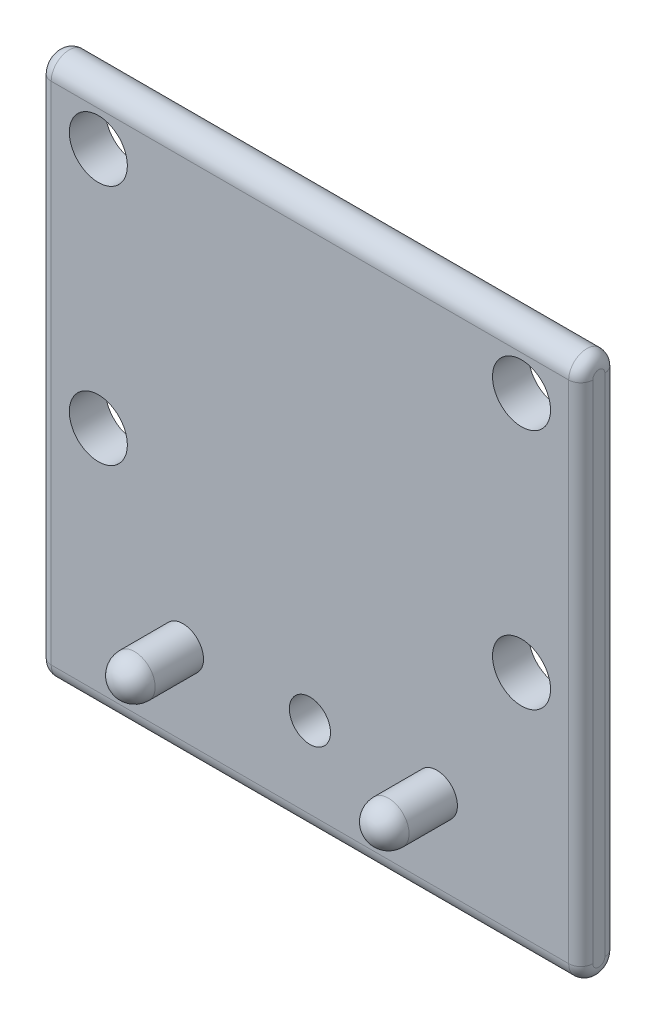
ISO-10303-21;
HEADER;
FILE_DESCRIPTION(('STEP AP214'),'2;1');
FILE_NAME('part.step','',(''),(''),'','','');
FILE_SCHEMA(('AUTOMOTIVE_DESIGN { 1 0 10303 214 1 1 1 1 }'));
ENDSEC;
DATA;
#1=APPLICATION_CONTEXT('core data for automotive mechanical design processes');
#2=APPLICATION_PROTOCOL_DEFINITION('international standard','automotive_design',2000,#1);
#3=PRODUCT_CONTEXT('',#1,'mechanical');
#4=PRODUCT('Part','Part','',(#3));
#5=PRODUCT_RELATED_PRODUCT_CATEGORY('part','',(#4));
#6=PRODUCT_DEFINITION_FORMATION('','',#4);
#7=PRODUCT_DEFINITION_CONTEXT('part definition',#1,'design');
#8=PRODUCT_DEFINITION('design','',#6,#7);
#9=PRODUCT_DEFINITION_SHAPE('','',#8);
#10=(LENGTH_UNIT() NAMED_UNIT(*) SI_UNIT(.MILLI.,.METRE.));
#11=(NAMED_UNIT(*) PLANE_ANGLE_UNIT() SI_UNIT($,.RADIAN.));
#12=(NAMED_UNIT(*) SI_UNIT($,.STERADIAN.) SOLID_ANGLE_UNIT());
#13=UNCERTAINTY_MEASURE_WITH_UNIT(LENGTH_MEASURE(1.E-05),#10,'distance_accuracy_value','');
#14=(GEOMETRIC_REPRESENTATION_CONTEXT(3) GLOBAL_UNCERTAINTY_ASSIGNED_CONTEXT((#13)) GLOBAL_UNIT_ASSIGNED_CONTEXT((#10,
#11,#12)) REPRESENTATION_CONTEXT('',''));
#15=CARTESIAN_POINT('',(0.,0.,0.));
#16=DIRECTION('',(0.,0.,1.));
#17=DIRECTION('',(1.,0.,0.));
#18=AXIS2_PLACEMENT_3D('',#15,#16,#17);
#19=CARTESIAN_POINT('',(22.4,43.305,0.));
#20=DIRECTION('',(1.,0.,0.));
#21=DIRECTION('',(0.,0.,-1.));
#22=AXIS2_PLACEMENT_3D('',#19,#20,#21);
#23=CYLINDRICAL_SURFACE('',#22,1.495);
#24=DIRECTION('',(1.,0.,0.));
#25=VECTOR('',#24,1.);
#26=CARTESIAN_POINT('',(-22.4,43.305,1.495));
#27=LINE('',#26,#25);
#28=CARTESIAN_POINT('',(21.4,43.305,1.495));
#29=VERTEX_POINT('',#28);
#30=CARTESIAN_POINT('',(-21.4,43.305,1.495));
#31=VERTEX_POINT('',#30);
#32=EDGE_CURVE('E473',#29,#31,#27,.F.);
#33=ORIENTED_EDGE('',*,*,#32,.F.);
#34=CARTESIAN_POINT('',(21.4,43.305,0.));
#35=DIRECTION('',(-1.,0.,0.));
#36=DIRECTION('',(0.,0.,1.));
#37=AXIS2_PLACEMENT_3D('',#34,#35,#36);
#38=CIRCLE('',#37,1.495);
#39=CARTESIAN_POINT('',(21.4,43.305,-1.495));
#40=VERTEX_POINT('',#39);
#41=EDGE_CURVE('E58',#29,#40,#38,.T.);
#42=ORIENTED_EDGE('',*,*,#41,.T.);
#43=DIRECTION('',(1.,0.,0.));
#44=VECTOR('',#43,1.);
#45=CARTESIAN_POINT('',(-22.4,43.305,-1.495));
#46=LINE('',#45,#44);
#47=CARTESIAN_POINT('',(-21.4,43.305,-1.495));
#48=VERTEX_POINT('',#47);
#49=EDGE_CURVE('E139',#48,#40,#46,.T.);
#50=ORIENTED_EDGE('',*,*,#49,.F.);
#51=CARTESIAN_POINT('',(-21.4,43.305,0.));
#52=DIRECTION('',(1.,0.,0.));
#53=DIRECTION('',(0.,0.,-1.));
#54=AXIS2_PLACEMENT_3D('',#51,#52,#53);
#55=CIRCLE('',#54,1.495);
#56=EDGE_CURVE('E156',#48,#31,#55,.T.);
#57=ORIENTED_EDGE('',*,*,#56,.T.);
#58=EDGE_LOOP('',(#33,#42,#50,#57));
#59=FACE_BOUND('',#58,.T.);
#60=ADVANCED_FACE('F48',(#59),#23,.T.);
#61=CARTESIAN_POINT('',(-22.4,1.495,0.));
#62=DIRECTION('',(1.,0.,0.));
#63=DIRECTION('',(0.,0.,-1.));
#64=AXIS2_PLACEMENT_3D('',#61,#62,#63);
#65=CYLINDRICAL_SURFACE('',#64,1.495);
#66=DIRECTION('',(-1.,0.,0.));
#67=VECTOR('',#66,1.);
#68=CARTESIAN_POINT('',(-22.4,1.495,-1.495));
#69=LINE('',#68,#67);
#70=CARTESIAN_POINT('',(21.4,1.495,-1.495));
#71=VERTEX_POINT('',#70);
#72=CARTESIAN_POINT('',(-21.4,1.495,-1.495));
#73=VERTEX_POINT('',#72);
#74=EDGE_CURVE('E219',#71,#73,#69,.T.);
#75=ORIENTED_EDGE('',*,*,#74,.F.);
#76=CARTESIAN_POINT('',(21.4,1.495,0.));
#77=DIRECTION('',(-1.,0.,0.));
#78=DIRECTION('',(0.,0.,1.));
#79=AXIS2_PLACEMENT_3D('',#76,#77,#78);
#80=CIRCLE('',#79,1.495);
#81=CARTESIAN_POINT('',(21.4,1.495,1.495));
#82=VERTEX_POINT('',#81);
#83=EDGE_CURVE('E185',#71,#82,#80,.T.);
#84=ORIENTED_EDGE('',*,*,#83,.T.);
#85=DIRECTION('',(-1.,0.,0.));
#86=VECTOR('',#85,1.);
#87=CARTESIAN_POINT('',(-22.4,1.495,1.495));
#88=LINE('',#87,#86);
#89=CARTESIAN_POINT('',(-21.4,1.495,1.495));
#90=VERTEX_POINT('',#89);
#91=EDGE_CURVE('E226',#90,#82,#88,.F.);
#92=ORIENTED_EDGE('',*,*,#91,.F.);
#93=CARTESIAN_POINT('',(-21.4,1.495,0.));
#94=DIRECTION('',(1.,0.,0.));
#95=DIRECTION('',(0.,0.,-1.));
#96=AXIS2_PLACEMENT_3D('',#93,#94,#95);
#97=CIRCLE('',#96,1.495);
#98=EDGE_CURVE('E124',#90,#73,#97,.T.);
#99=ORIENTED_EDGE('',*,*,#98,.T.);
#100=EDGE_LOOP('',(#75,#84,#92,#99));
#101=FACE_BOUND('',#100,.T.);
#102=ADVANCED_FACE('F222',(#101),#65,.T.);
#103=CARTESIAN_POINT('',(22.4,44.8,1.495));
#104=DIRECTION('',(-1.,0.,0.));
#105=DIRECTION('',(0.,0.,1.));
#106=AXIS2_PLACEMENT_3D('',#103,#104,#105);
#107=PLANE('',#106);
#108=DIRECTION('',(0.,-1.,0.));
#109=VECTOR('',#108,1.);
#110=CARTESIAN_POINT('',(22.4,44.8,0.495));
#111=LINE('',#110,#109);
#112=CARTESIAN_POINT('',(22.4,43.305,0.495000000000001));
#113=VERTEX_POINT('',#112);
#114=CARTESIAN_POINT('',(22.4,1.495,0.495));
#115=VERTEX_POINT('',#114);
#116=EDGE_CURVE('E178',#113,#115,#111,.T.);
#117=ORIENTED_EDGE('',*,*,#116,.T.);
#118=CARTESIAN_POINT('',(22.4,1.495,0.));
#119=DIRECTION('',(-1.,0.,0.));
#120=DIRECTION('',(0.,0.,1.));
#121=AXIS2_PLACEMENT_3D('',#118,#119,#120);
#122=CIRCLE('',#121,0.495000000000001);
#123=CARTESIAN_POINT('',(22.4,1.495,-0.495));
#124=VERTEX_POINT('',#123);
#125=EDGE_CURVE('E181',#115,#124,#122,.F.);
#126=ORIENTED_EDGE('',*,*,#125,.T.);
#127=DIRECTION('',(0.,-1.,0.));
#128=VECTOR('',#127,1.);
#129=CARTESIAN_POINT('',(22.4,44.8,-0.495));
#130=LINE('',#129,#128);
#131=CARTESIAN_POINT('',(22.4,43.305,-0.495));
#132=VERTEX_POINT('',#131);
#133=EDGE_CURVE('E162',#124,#132,#130,.F.);
#134=ORIENTED_EDGE('',*,*,#133,.T.);
#135=CARTESIAN_POINT('',(22.4,43.305,0.));
#136=DIRECTION('',(-1.,0.,0.));
#137=DIRECTION('',(0.,0.,1.));
#138=AXIS2_PLACEMENT_3D('',#135,#136,#137);
#139=CIRCLE('',#138,0.495000000000001);
#140=EDGE_CURVE('E175',#132,#113,#139,.F.);
#141=ORIENTED_EDGE('',*,*,#140,.T.);
#142=EDGE_LOOP('',(#117,#126,#134,#141));
#143=FACE_BOUND('',#142,.T.);
#144=ADVANCED_FACE('F232',(#143),#107,.F.);
#145=CARTESIAN_POINT('',(-22.4,44.8,-1.495));
#146=DIRECTION('',(0.,0.,1.));
#147=DIRECTION('',(1.,0.,0.));
#148=AXIS2_PLACEMENT_3D('',#145,#146,#147);
#149=PLANE('',#148);
#150=CARTESIAN_POINT('',(0.,8.2,-1.495));
#151=DIRECTION('',(0.,0.,1.));
#152=DIRECTION('',(1.,0.,0.));
#153=AXIS2_PLACEMENT_3D('',#150,#151,#152);
#154=CIRCLE('',#153,1.7);
#155=CARTESIAN_POINT('',(1.7,8.2,-1.495));
#156=VERTEX_POINT('',#155);
#157=EDGE_CURVE('E515',#156,#156,#154,.T.);
#158=ORIENTED_EDGE('',*,*,#157,.T.);
#159=EDGE_LOOP('',(#158));
#160=FACE_BOUND('',#159,.T.);
#161=CARTESIAN_POINT('',(-17.5,40.4,-1.495));
#162=DIRECTION('',(0.,0.,1.));
#163=DIRECTION('',(1.,0.,0.));
#164=AXIS2_PLACEMENT_3D('',#161,#162,#163);
#165=CIRCLE('',#164,2.39999999999999);
#166=CARTESIAN_POINT('',(-15.1,40.4,-1.495));
#167=VERTEX_POINT('',#166);
#168=EDGE_CURVE('E509',#167,#167,#165,.T.);
#169=ORIENTED_EDGE('',*,*,#168,.T.);
#170=EDGE_LOOP('',(#169));
#171=FACE_BOUND('',#170,.T.);
#172=CARTESIAN_POINT('',(-17.5,20.4,-1.495));
#173=DIRECTION('',(0.,0.,1.));
#174=DIRECTION('',(1.,0.,0.));
#175=AXIS2_PLACEMENT_3D('',#172,#173,#174);
#176=CIRCLE('',#175,2.39999999999999);
#177=CARTESIAN_POINT('',(-15.1,20.4,-1.495));
#178=VERTEX_POINT('',#177);
#179=EDGE_CURVE('E502',#178,#178,#176,.T.);
#180=ORIENTED_EDGE('',*,*,#179,.T.);
#181=EDGE_LOOP('',(#180));
#182=FACE_BOUND('',#181,.T.);
#183=CARTESIAN_POINT('',(17.5,20.4,-1.495));
#184=DIRECTION('',(0.,0.,1.));
#185=DIRECTION('',(1.,0.,0.));
#186=AXIS2_PLACEMENT_3D('',#183,#184,#185);
#187=CIRCLE('',#186,2.39999999999999);
#188=CARTESIAN_POINT('',(19.9,20.4,-1.495));
#189=VERTEX_POINT('',#188);
#190=EDGE_CURVE('E454',#189,#189,#187,.T.);
#191=ORIENTED_EDGE('',*,*,#190,.T.);
#192=EDGE_LOOP('',(#191));
#193=FACE_BOUND('',#192,.T.);
#194=CARTESIAN_POINT('',(17.5,40.4,-1.495));
#195=DIRECTION('',(0.,0.,1.));
#196=DIRECTION('',(1.,0.,0.));
#197=AXIS2_PLACEMENT_3D('',#194,#195,#196);
#198=CIRCLE('',#197,2.39999999999999);
#199=CARTESIAN_POINT('',(19.9,40.4,-1.495));
#200=VERTEX_POINT('',#199);
#201=EDGE_CURVE('E448',#200,#200,#198,.T.);
#202=ORIENTED_EDGE('',*,*,#201,.T.);
#203=EDGE_LOOP('',(#202));
#204=FACE_BOUND('',#203,.T.);
#205=ORIENTED_EDGE('',*,*,#49,.T.);
#206=DIRECTION('',(0.,-1.,0.));
#207=VECTOR('',#206,1.);
#208=CARTESIAN_POINT('',(21.4,44.8,-1.495));
#209=LINE('',#208,#207);
#210=EDGE_CURVE('E11',#40,#71,#209,.T.);
#211=ORIENTED_EDGE('',*,*,#210,.T.);
#212=ORIENTED_EDGE('',*,*,#74,.T.);
#213=DIRECTION('',(0.,-1.,0.));
#214=VECTOR('',#213,1.);
#215=CARTESIAN_POINT('',(-21.4,44.8,-1.495));
#216=LINE('',#215,#214);
#217=EDGE_CURVE('E149',#73,#48,#216,.F.);
#218=ORIENTED_EDGE('',*,*,#217,.T.);
#219=EDGE_LOOP('',(#205,#211,#212,#218));
#220=FACE_BOUND('',#219,.T.);
#221=ADVANCED_FACE('F218',(#160,#171,#182,#193,#204,#220),#149,.F.);
#222=CARTESIAN_POINT('',(-22.4,44.8,1.495));
#223=DIRECTION('',(1.,0.,0.));
#224=DIRECTION('',(0.,0.,-1.));
#225=AXIS2_PLACEMENT_3D('',#222,#223,#224);
#226=PLANE('',#225);
#227=DIRECTION('',(0.,-1.,0.));
#228=VECTOR('',#227,1.);
#229=CARTESIAN_POINT('',(-22.4,44.8,-0.495));
#230=LINE('',#229,#228);
#231=CARTESIAN_POINT('',(-22.4,43.305,-0.495000000000001));
#232=VERTEX_POINT('',#231);
#233=CARTESIAN_POINT('',(-22.4,1.495,-0.495));
#234=VERTEX_POINT('',#233);
#235=EDGE_CURVE('E143',#232,#234,#230,.T.);
#236=ORIENTED_EDGE('',*,*,#235,.T.);
#237=CARTESIAN_POINT('',(-22.4,1.495,0.));
#238=DIRECTION('',(1.,0.,0.));
#239=DIRECTION('',(0.,0.,-1.));
#240=AXIS2_PLACEMENT_3D('',#237,#238,#239);
#241=CIRCLE('',#240,0.495000000000001);
#242=CARTESIAN_POINT('',(-22.4,1.495,0.495));
#243=VERTEX_POINT('',#242);
#244=EDGE_CURVE('E122',#234,#243,#241,.F.);
#245=ORIENTED_EDGE('',*,*,#244,.T.);
#246=DIRECTION('',(0.,-1.,0.));
#247=VECTOR('',#246,1.);
#248=CARTESIAN_POINT('',(-22.4,44.8,0.495));
#249=LINE('',#248,#247);
#250=CARTESIAN_POINT('',(-22.4,43.305,0.495));
#251=VERTEX_POINT('',#250);
#252=EDGE_CURVE('E131',#243,#251,#249,.F.);
#253=ORIENTED_EDGE('',*,*,#252,.T.);
#254=CARTESIAN_POINT('',(-22.4,43.305,0.));
#255=DIRECTION('',(1.,0.,0.));
#256=DIRECTION('',(0.,0.,-1.));
#257=AXIS2_PLACEMENT_3D('',#254,#255,#256);
#258=CIRCLE('',#257,0.495000000000001);
#259=EDGE_CURVE('E138',#251,#232,#258,.F.);
#260=ORIENTED_EDGE('',*,*,#259,.T.);
#261=EDGE_LOOP('',(#236,#245,#253,#260));
#262=FACE_BOUND('',#261,.T.);
#263=ADVANCED_FACE('F141',(#262),#226,.F.);
#264=CARTESIAN_POINT('',(-22.4,44.8,1.495));
#265=DIRECTION('',(0.,0.,-1.));
#266=DIRECTION('',(-1.,0.,0.));
#267=AXIS2_PLACEMENT_3D('',#264,#265,#266);
#268=PLANE('',#267);
#269=CARTESIAN_POINT('',(-10.5,8.2,1.495));
#270=DIRECTION('',(0.,0.,-1.));
#271=DIRECTION('',(-1.,0.,0.));
#272=AXIS2_PLACEMENT_3D('',#269,#270,#271);
#273=CIRCLE('',#272,1.7);
#274=CARTESIAN_POINT('',(-12.2,8.2,1.495));
#275=VERTEX_POINT('',#274);
#276=EDGE_CURVE('E469',#275,#275,#273,.F.);
#277=ORIENTED_EDGE('',*,*,#276,.F.);
#278=EDGE_LOOP('',(#277));
#279=FACE_BOUND('',#278,.T.);
#280=CARTESIAN_POINT('',(10.5,8.2,1.495));
#281=DIRECTION('',(0.,0.,-1.));
#282=DIRECTION('',(-1.,0.,0.));
#283=AXIS2_PLACEMENT_3D('',#280,#281,#282);
#284=CIRCLE('',#283,1.7);
#285=CARTESIAN_POINT('',(8.8,8.2,1.495));
#286=VERTEX_POINT('',#285);
#287=EDGE_CURVE('E225',#286,#286,#284,.F.);
#288=ORIENTED_EDGE('',*,*,#287,.F.);
#289=EDGE_LOOP('',(#288));
#290=FACE_BOUND('',#289,.T.);
#291=CARTESIAN_POINT('',(0.,8.2,1.495));
#292=DIRECTION('',(0.,0.,1.));
#293=DIRECTION('',(1.,0.,0.));
#294=AXIS2_PLACEMENT_3D('',#291,#292,#293);
#295=CIRCLE('',#294,1.7);
#296=CARTESIAN_POINT('',(1.7,8.2,1.495));
#297=VERTEX_POINT('',#296);
#298=EDGE_CURVE('E489',#297,#297,#295,.T.);
#299=ORIENTED_EDGE('',*,*,#298,.F.);
#300=EDGE_LOOP('',(#299));
#301=FACE_BOUND('',#300,.T.);
#302=CARTESIAN_POINT('',(-17.5,40.4,1.495));
#303=DIRECTION('',(0.,0.,1.));
#304=DIRECTION('',(1.,0.,0.));
#305=AXIS2_PLACEMENT_3D('',#302,#303,#304);
#306=CIRCLE('',#305,2.39999999999999);
#307=CARTESIAN_POINT('',(-15.1,40.4,1.495));
#308=VERTEX_POINT('',#307);
#309=EDGE_CURVE('E493',#308,#308,#306,.T.);
#310=ORIENTED_EDGE('',*,*,#309,.F.);
#311=EDGE_LOOP('',(#310));
#312=FACE_BOUND('',#311,.T.);
#313=CARTESIAN_POINT('',(-17.5,20.4,1.495));
#314=DIRECTION('',(0.,0.,1.));
#315=DIRECTION('',(1.,0.,0.));
#316=AXIS2_PLACEMENT_3D('',#313,#314,#315);
#317=CIRCLE('',#316,2.39999999999999);
#318=CARTESIAN_POINT('',(-15.1,20.4,1.495));
#319=VERTEX_POINT('',#318);
#320=EDGE_CURVE('E497',#319,#319,#317,.T.);
#321=ORIENTED_EDGE('',*,*,#320,.F.);
#322=EDGE_LOOP('',(#321));
#323=FACE_BOUND('',#322,.T.);
#324=CARTESIAN_POINT('',(17.5,20.4,1.495));
#325=DIRECTION('',(0.,0.,1.));
#326=DIRECTION('',(1.,0.,0.));
#327=AXIS2_PLACEMENT_3D('',#324,#325,#326);
#328=CIRCLE('',#327,2.39999999999999);
#329=CARTESIAN_POINT('',(19.9,20.4,1.495));
#330=VERTEX_POINT('',#329);
#331=EDGE_CURVE('E460',#330,#330,#328,.T.);
#332=ORIENTED_EDGE('',*,*,#331,.F.);
#333=EDGE_LOOP('',(#332));
#334=FACE_BOUND('',#333,.T.);
#335=CARTESIAN_POINT('',(17.5,40.4,1.495));
#336=DIRECTION('',(0.,0.,1.));
#337=DIRECTION('',(1.,0.,0.));
#338=AXIS2_PLACEMENT_3D('',#335,#336,#337);
#339=CIRCLE('',#338,2.39999999999999);
#340=CARTESIAN_POINT('',(19.9,40.4,1.495));
#341=VERTEX_POINT('',#340);
#342=EDGE_CURVE('E451',#341,#341,#339,.T.);
#343=ORIENTED_EDGE('',*,*,#342,.F.);
#344=EDGE_LOOP('',(#343));
#345=FACE_BOUND('',#344,.T.);
#346=ORIENTED_EDGE('',*,*,#91,.T.);
#347=DIRECTION('',(0.,-1.,0.));
#348=VECTOR('',#347,1.);
#349=CARTESIAN_POINT('',(21.4,44.8,1.495));
#350=LINE('',#349,#348);
#351=EDGE_CURVE('E73',#82,#29,#350,.F.);
#352=ORIENTED_EDGE('',*,*,#351,.T.);
#353=ORIENTED_EDGE('',*,*,#32,.T.);
#354=DIRECTION('',(0.,-1.,0.));
#355=VECTOR('',#354,1.);
#356=CARTESIAN_POINT('',(-21.4,44.8,1.495));
#357=LINE('',#356,#355);
#358=EDGE_CURVE('E160',#31,#90,#357,.T.);
#359=ORIENTED_EDGE('',*,*,#358,.T.);
#360=EDGE_LOOP('',(#346,#352,#353,#359));
#361=FACE_BOUND('',#360,.T.);
#362=ADVANCED_FACE('F278',(#279,#290,#301,#312,#323,#334,#345,#361),#268,.F.);
#363=CARTESIAN_POINT('',(17.5,40.4,1.495));
#364=DIRECTION('',(0.,0.,1.));
#365=DIRECTION('',(1.,0.,0.));
#366=AXIS2_PLACEMENT_3D('',#363,#364,#365);
#367=CYLINDRICAL_SURFACE('',#366,2.39999999999999);
#368=ORIENTED_EDGE('',*,*,#201,.F.);
#369=EDGE_LOOP('',(#368));
#370=FACE_BOUND('',#369,.T.);
#371=ORIENTED_EDGE('',*,*,#342,.T.);
#372=EDGE_LOOP('',(#371));
#373=FACE_BOUND('',#372,.T.);
#374=ADVANCED_FACE('F281',(#370,#373),#367,.F.);
#375=CARTESIAN_POINT('',(17.5,20.4,1.495));
#376=DIRECTION('',(0.,0.,1.));
#377=DIRECTION('',(1.,0.,0.));
#378=AXIS2_PLACEMENT_3D('',#375,#376,#377);
#379=CYLINDRICAL_SURFACE('',#378,2.39999999999999);
#380=ORIENTED_EDGE('',*,*,#190,.F.);
#381=EDGE_LOOP('',(#380));
#382=FACE_BOUND('',#381,.T.);
#383=ORIENTED_EDGE('',*,*,#331,.T.);
#384=EDGE_LOOP('',(#383));
#385=FACE_BOUND('',#384,.T.);
#386=ADVANCED_FACE('F413',(#382,#385),#379,.F.);
#387=CARTESIAN_POINT('',(-17.5,20.4,1.495));
#388=DIRECTION('',(0.,0.,1.));
#389=DIRECTION('',(1.,0.,0.));
#390=AXIS2_PLACEMENT_3D('',#387,#388,#389);
#391=CYLINDRICAL_SURFACE('',#390,2.39999999999999);
#392=ORIENTED_EDGE('',*,*,#179,.F.);
#393=EDGE_LOOP('',(#392));
#394=FACE_BOUND('',#393,.T.);
#395=ORIENTED_EDGE('',*,*,#320,.T.);
#396=EDGE_LOOP('',(#395));
#397=FACE_BOUND('',#396,.T.);
#398=ADVANCED_FACE('F404',(#394,#397),#391,.F.);
#399=CARTESIAN_POINT('',(-17.5,40.4,1.495));
#400=DIRECTION('',(0.,0.,1.));
#401=DIRECTION('',(1.,0.,0.));
#402=AXIS2_PLACEMENT_3D('',#399,#400,#401);
#403=CYLINDRICAL_SURFACE('',#402,2.39999999999999);
#404=ORIENTED_EDGE('',*,*,#168,.F.);
#405=EDGE_LOOP('',(#404));
#406=FACE_BOUND('',#405,.T.);
#407=ORIENTED_EDGE('',*,*,#309,.T.);
#408=EDGE_LOOP('',(#407));
#409=FACE_BOUND('',#408,.T.);
#410=ADVANCED_FACE('F395',(#406,#409),#403,.F.);
#411=CARTESIAN_POINT('',(0.,8.2,1.495));
#412=DIRECTION('',(0.,0.,1.));
#413=DIRECTION('',(1.,0.,0.));
#414=AXIS2_PLACEMENT_3D('',#411,#412,#413);
#415=CYLINDRICAL_SURFACE('',#414,1.7);
#416=ORIENTED_EDGE('',*,*,#157,.F.);
#417=EDGE_LOOP('',(#416));
#418=FACE_BOUND('',#417,.T.);
#419=ORIENTED_EDGE('',*,*,#298,.T.);
#420=EDGE_LOOP('',(#419));
#421=FACE_BOUND('',#420,.T.);
#422=ADVANCED_FACE('F386',(#418,#421),#415,.F.);
#423=CARTESIAN_POINT('',(10.5,8.2,5.495));
#424=DIRECTION('',(0.,0.,-1.));
#425=DIRECTION('',(-1.,0.,0.));
#426=AXIS2_PLACEMENT_3D('',#423,#424,#425);
#427=CYLINDRICAL_SURFACE('',#426,1.7);
#428=CARTESIAN_POINT('',(10.5,8.2,5.495));
#429=DIRECTION('',(0.,0.,1.));
#430=DIRECTION('',(1.,0.,0.));
#431=AXIS2_PLACEMENT_3D('',#428,#429,#430);
#432=CIRCLE('',#431,1.7);
#433=CARTESIAN_POINT('',(12.2,8.2,5.495));
#434=VERTEX_POINT('',#433);
#435=EDGE_CURVE('E172',#434,#434,#432,.T.);
#436=ORIENTED_EDGE('',*,*,#435,.F.);
#437=EDGE_LOOP('',(#436));
#438=FACE_BOUND('',#437,.T.);
#439=ORIENTED_EDGE('',*,*,#287,.T.);
#440=EDGE_LOOP('',(#439));
#441=FACE_BOUND('',#440,.T.);
#442=ADVANCED_FACE('F377',(#438,#441),#427,.T.);
#443=CARTESIAN_POINT('',(-10.5,8.2,5.495));
#444=DIRECTION('',(0.,0.,-1.));
#445=DIRECTION('',(-1.,0.,0.));
#446=AXIS2_PLACEMENT_3D('',#443,#444,#445);
#447=CYLINDRICAL_SURFACE('',#446,1.7);
#448=CARTESIAN_POINT('',(-10.5,8.2,5.495));
#449=DIRECTION('',(0.,0.,1.));
#450=DIRECTION('',(1.,0.,0.));
#451=AXIS2_PLACEMENT_3D('',#448,#449,#450);
#452=CIRCLE('',#451,1.7);
#453=CARTESIAN_POINT('',(-8.8,8.2,5.495));
#454=VERTEX_POINT('',#453);
#455=EDGE_CURVE('E521',#454,#454,#452,.T.);
#456=ORIENTED_EDGE('',*,*,#455,.F.);
#457=EDGE_LOOP('',(#456));
#458=FACE_BOUND('',#457,.T.);
#459=ORIENTED_EDGE('',*,*,#276,.T.);
#460=EDGE_LOOP('',(#459));
#461=FACE_BOUND('',#460,.T.);
#462=ADVANCED_FACE('F368',(#458,#461),#447,.T.);
#463=CARTESIAN_POINT('',(-10.5,8.2,5.495));
#464=DIRECTION('',(0.,1.,0.));
#465=DIRECTION('',(-1.,0.,0.));
#466=AXIS2_PLACEMENT_3D('',#463,#464,#465);
#467=SPHERICAL_SURFACE('',#466,1.7);
#468=CARTESIAN_POINT('',(-10.5,8.2,5.495));
#469=DIRECTION('',(0.,0.,1.));
#470=DIRECTION('',(1.,0.,0.));
#471=AXIS2_PLACEMENT_3D('',#468,#469,#470);
#472=SPHERICAL_SURFACE('',#471,1.7);
#473=ORIENTED_EDGE('',*,*,#455,.T.);
#474=EDGE_LOOP('',(#473));
#475=FACE_BOUND('',#474,.T.);
#476=ADVANCED_FACE('F360',(#475),#472,.T.);
#477=CARTESIAN_POINT('',(10.5,8.2,5.495));
#478=DIRECTION('',(0.,1.,0.));
#479=DIRECTION('',(-1.,0.,0.));
#480=AXIS2_PLACEMENT_3D('',#477,#478,#479);
#481=SPHERICAL_SURFACE('',#480,1.7);
#482=CARTESIAN_POINT('',(10.5,8.2,5.495));
#483=DIRECTION('',(0.,0.,1.));
#484=DIRECTION('',(1.,0.,0.));
#485=AXIS2_PLACEMENT_3D('',#482,#483,#484);
#486=SPHERICAL_SURFACE('',#485,1.7);
#487=ORIENTED_EDGE('',*,*,#435,.T.);
#488=EDGE_LOOP('',(#487));
#489=FACE_BOUND('',#488,.T.);
#490=ADVANCED_FACE('F262',(#489),#486,.T.);
#491=CARTESIAN_POINT('',(-21.4,43.305,0.));
#492=DIRECTION('',(1.,0.,0.));
#493=DIRECTION('',(0.,0.,-1.));
#494=AXIS2_PLACEMENT_3D('',#491,#492,#493);
#495=DEGENERATE_TOROIDAL_SURFACE('',#494,0.495000000000001,1.,.T.);
#496=CARTESIAN_POINT('',(-21.4,43.305,0.495000000000001));
#497=DIRECTION('',(0.,-1.,0.));
#498=DIRECTION('',(0.,0.,-1.));
#499=AXIS2_PLACEMENT_3D('',#496,#497,#498);
#500=CIRCLE('',#499,1.);
#501=EDGE_CURVE('E134',#31,#251,#500,.T.);
#502=ORIENTED_EDGE('',*,*,#501,.F.);
#503=ORIENTED_EDGE('',*,*,#56,.F.);
#504=CARTESIAN_POINT('',(-21.4,43.305,-0.495000000000001));
#505=DIRECTION('',(0.,-1.,0.));
#506=DIRECTION('',(0.,0.,-1.));
#507=AXIS2_PLACEMENT_3D('',#504,#505,#506);
#508=CIRCLE('',#507,1.);
#509=EDGE_CURVE('E168',#232,#48,#508,.T.);
#510=ORIENTED_EDGE('',*,*,#509,.F.);
#511=ORIENTED_EDGE('',*,*,#259,.F.);
#512=EDGE_LOOP('',(#502,#503,#510,#511));
#513=FACE_BOUND('',#512,.T.);
#514=ADVANCED_FACE('F258',(#513),#495,.T.);
#515=CARTESIAN_POINT('',(-21.4,44.8,-0.495));
#516=DIRECTION('',(0.,-1.,0.));
#517=DIRECTION('',(0.,0.,-1.));
#518=AXIS2_PLACEMENT_3D('',#515,#516,#517);
#519=CYLINDRICAL_SURFACE('',#518,1.);
#520=ORIENTED_EDGE('',*,*,#509,.T.);
#521=ORIENTED_EDGE('',*,*,#217,.F.);
#522=CARTESIAN_POINT('',(-21.4,1.495,-0.495));
#523=DIRECTION('',(0.,-1.,0.));
#524=DIRECTION('',(0.,0.,-1.));
#525=AXIS2_PLACEMENT_3D('',#522,#523,#524);
#526=CIRCLE('',#525,1.);
#527=EDGE_CURVE('E128',#234,#73,#526,.T.);
#528=ORIENTED_EDGE('',*,*,#527,.F.);
#529=ORIENTED_EDGE('',*,*,#235,.F.);
#530=EDGE_LOOP('',(#520,#521,#528,#529));
#531=FACE_BOUND('',#530,.T.);
#532=ADVANCED_FACE('F255',(#531),#519,.T.);
#533=CARTESIAN_POINT('',(-21.4,44.8,0.495));
#534=DIRECTION('',(0.,-1.,0.));
#535=DIRECTION('',(0.,0.,-1.));
#536=AXIS2_PLACEMENT_3D('',#533,#534,#535);
#537=CYLINDRICAL_SURFACE('',#536,1.);
#538=ORIENTED_EDGE('',*,*,#501,.T.);
#539=ORIENTED_EDGE('',*,*,#252,.F.);
#540=CARTESIAN_POINT('',(-21.4,1.495,0.495));
#541=DIRECTION('',(0.,-1.,0.));
#542=DIRECTION('',(0.,0.,-1.));
#543=AXIS2_PLACEMENT_3D('',#540,#541,#542);
#544=CIRCLE('',#543,1.);
#545=EDGE_CURVE('E117',#90,#243,#544,.T.);
#546=ORIENTED_EDGE('',*,*,#545,.F.);
#547=ORIENTED_EDGE('',*,*,#358,.F.);
#548=EDGE_LOOP('',(#538,#539,#546,#547));
#549=FACE_BOUND('',#548,.T.);
#550=ADVANCED_FACE('F132',(#549),#537,.T.);
#551=CARTESIAN_POINT('',(-21.4,1.495,0.));
#552=DIRECTION('',(1.,0.,0.));
#553=DIRECTION('',(0.,0.,-1.));
#554=AXIS2_PLACEMENT_3D('',#551,#552,#553);
#555=DEGENERATE_TOROIDAL_SURFACE('',#554,0.495000000000001,1.,.T.);
#556=ORIENTED_EDGE('',*,*,#527,.T.);
#557=ORIENTED_EDGE('',*,*,#98,.F.);
#558=ORIENTED_EDGE('',*,*,#545,.T.);
#559=ORIENTED_EDGE('',*,*,#244,.F.);
#560=EDGE_LOOP('',(#556,#557,#558,#559));
#561=FACE_BOUND('',#560,.T.);
#562=ADVANCED_FACE('F120',(#561),#555,.T.);
#563=CARTESIAN_POINT('',(21.4,43.305,0.));
#564=DIRECTION('',(-1.,0.,0.));
#565=DIRECTION('',(0.,0.,1.));
#566=AXIS2_PLACEMENT_3D('',#563,#564,#565);
#567=DEGENERATE_TOROIDAL_SURFACE('',#566,0.495000000000001,1.,.T.);
#568=CARTESIAN_POINT('',(21.4,43.305,-0.495000000000001));
#569=DIRECTION('',(0.,-1.,0.));
#570=DIRECTION('',(0.,0.,-1.));
#571=AXIS2_PLACEMENT_3D('',#568,#569,#570);
#572=CIRCLE('',#571,1.);
#573=EDGE_CURVE('E198',#40,#132,#572,.T.);
#574=ORIENTED_EDGE('',*,*,#573,.F.);
#575=ORIENTED_EDGE('',*,*,#41,.F.);
#576=CARTESIAN_POINT('',(21.4,43.305,0.495000000000001));
#577=DIRECTION('',(0.,-1.,0.));
#578=DIRECTION('',(0.,0.,-1.));
#579=AXIS2_PLACEMENT_3D('',#576,#577,#578);
#580=CIRCLE('',#579,1.);
#581=EDGE_CURVE('E52',#113,#29,#580,.T.);
#582=ORIENTED_EDGE('',*,*,#581,.F.);
#583=ORIENTED_EDGE('',*,*,#140,.F.);
#584=EDGE_LOOP('',(#574,#575,#582,#583));
#585=FACE_BOUND('',#584,.T.);
#586=ADVANCED_FACE('F50',(#585),#567,.T.);
#587=CARTESIAN_POINT('',(21.4,44.8,0.495));
#588=DIRECTION('',(0.,-1.,0.));
#589=DIRECTION('',(0.,0.,-1.));
#590=AXIS2_PLACEMENT_3D('',#587,#588,#589);
#591=CYLINDRICAL_SURFACE('',#590,1.);
#592=ORIENTED_EDGE('',*,*,#581,.T.);
#593=ORIENTED_EDGE('',*,*,#351,.F.);
#594=CARTESIAN_POINT('',(21.4,1.495,0.495));
#595=DIRECTION('',(0.,-1.,0.));
#596=DIRECTION('',(0.,0.,-1.));
#597=AXIS2_PLACEMENT_3D('',#594,#595,#596);
#598=CIRCLE('',#597,1.);
#599=EDGE_CURVE('E196',#115,#82,#598,.T.);
#600=ORIENTED_EDGE('',*,*,#599,.F.);
#601=ORIENTED_EDGE('',*,*,#116,.F.);
#602=EDGE_LOOP('',(#592,#593,#600,#601));
#603=FACE_BOUND('',#602,.T.);
#604=ADVANCED_FACE('F210',(#603),#591,.T.);
#605=CARTESIAN_POINT('',(21.4,44.8,-0.495));
#606=DIRECTION('',(0.,-1.,0.));
#607=DIRECTION('',(0.,0.,-1.));
#608=AXIS2_PLACEMENT_3D('',#605,#606,#607);
#609=CYLINDRICAL_SURFACE('',#608,1.);
#610=ORIENTED_EDGE('',*,*,#573,.T.);
#611=ORIENTED_EDGE('',*,*,#133,.F.);
#612=CARTESIAN_POINT('',(21.4,1.495,-0.495));
#613=DIRECTION('',(0.,-1.,0.));
#614=DIRECTION('',(0.,0.,-1.));
#615=AXIS2_PLACEMENT_3D('',#612,#613,#614);
#616=CIRCLE('',#615,1.);
#617=EDGE_CURVE('E193',#71,#124,#616,.T.);
#618=ORIENTED_EDGE('',*,*,#617,.F.);
#619=ORIENTED_EDGE('',*,*,#210,.F.);
#620=EDGE_LOOP('',(#610,#611,#618,#619));
#621=FACE_BOUND('',#620,.T.);
#622=ADVANCED_FACE('F215',(#621),#609,.T.);
#623=CARTESIAN_POINT('',(21.4,1.495,0.));
#624=DIRECTION('',(-1.,0.,0.));
#625=DIRECTION('',(0.,0.,1.));
#626=AXIS2_PLACEMENT_3D('',#623,#624,#625);
#627=DEGENERATE_TOROIDAL_SURFACE('',#626,0.495000000000001,1.,.T.);
#628=ORIENTED_EDGE('',*,*,#599,.T.);
#629=ORIENTED_EDGE('',*,*,#83,.F.);
#630=ORIENTED_EDGE('',*,*,#617,.T.);
#631=ORIENTED_EDGE('',*,*,#125,.F.);
#632=EDGE_LOOP('',(#628,#629,#630,#631));
#633=FACE_BOUND('',#632,.T.);
#634=ADVANCED_FACE('F229',(#633),#627,.T.);
#635=CLOSED_SHELL('',(#60,#102,#144,#221,#263,#362,#374,#386,#398,#410,#422,#442,#462,#476,#490,
#514,#532,#550,#562,#586,#604,#622,#634));
#636=MANIFOLD_SOLID_BREP('B2',#635);
#637=ADVANCED_BREP_SHAPE_REPRESENTATION('',(#18,#636),#14);
#638=SHAPE_DEFINITION_REPRESENTATION(#9,#637);
ENDSEC;
END-ISO-10303-21;
